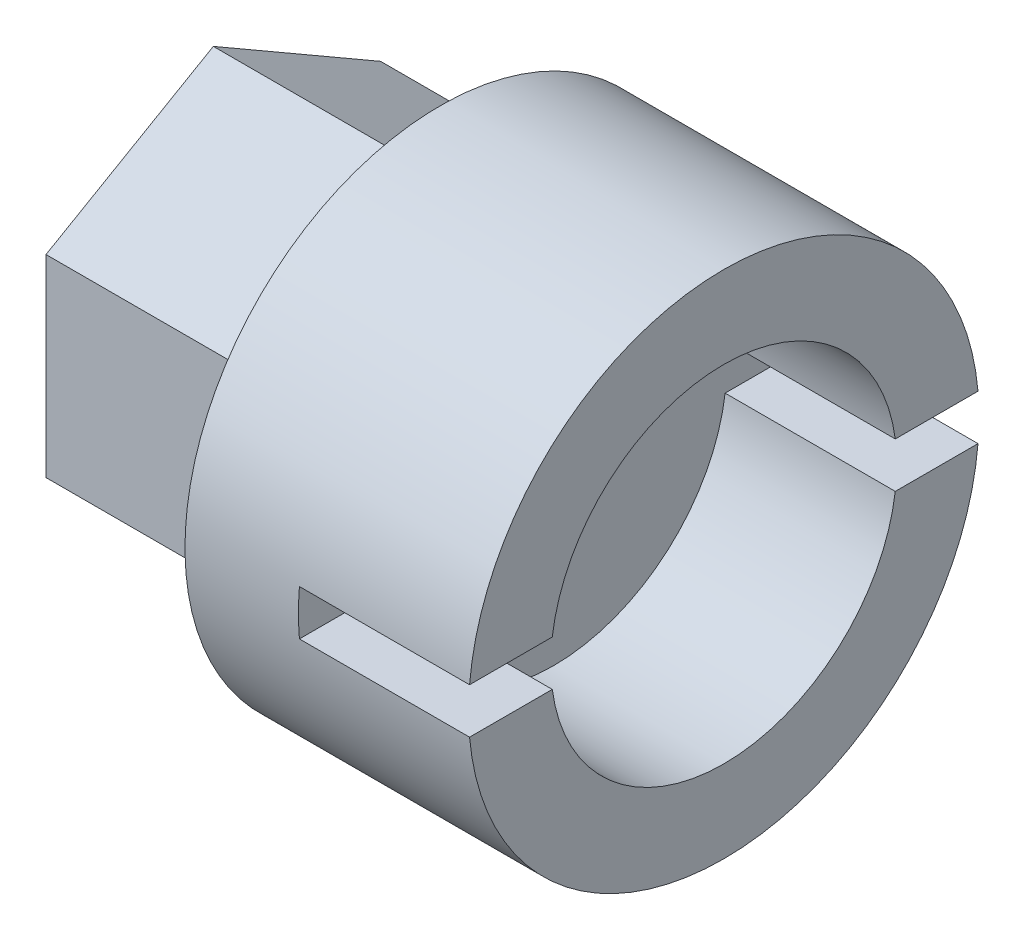
ISO-10303-21;
HEADER;
FILE_DESCRIPTION(('STEP AP214'),'2;1');
FILE_NAME('part.step','',(''),(''),'','','');
FILE_SCHEMA(('AUTOMOTIVE_DESIGN { 1 0 10303 214 1 1 1 1 }'));
ENDSEC;
DATA;
#1=APPLICATION_CONTEXT('core data for automotive mechanical design processes');
#2=APPLICATION_PROTOCOL_DEFINITION('international standard','automotive_design',2000,#1);
#3=PRODUCT_CONTEXT('',#1,'mechanical');
#4=PRODUCT('Part','Part','',(#3));
#5=PRODUCT_RELATED_PRODUCT_CATEGORY('part','',(#4));
#6=PRODUCT_DEFINITION_FORMATION('','',#4);
#7=PRODUCT_DEFINITION_CONTEXT('part definition',#1,'design');
#8=PRODUCT_DEFINITION('design','',#6,#7);
#9=PRODUCT_DEFINITION_SHAPE('','',#8);
#10=(LENGTH_UNIT() NAMED_UNIT(*) SI_UNIT(.MILLI.,.METRE.));
#11=(NAMED_UNIT(*) PLANE_ANGLE_UNIT() SI_UNIT($,.RADIAN.));
#12=(NAMED_UNIT(*) SI_UNIT($,.STERADIAN.) SOLID_ANGLE_UNIT());
#13=UNCERTAINTY_MEASURE_WITH_UNIT(LENGTH_MEASURE(1.E-05),#10,'distance_accuracy_value','');
#14=(GEOMETRIC_REPRESENTATION_CONTEXT(3) GLOBAL_UNCERTAINTY_ASSIGNED_CONTEXT((#13)) GLOBAL_UNIT_ASSIGNED_CONTEXT((#10,
#11,#12)) REPRESENTATION_CONTEXT('',''));
#15=CARTESIAN_POINT('',(0.,0.,0.));
#16=DIRECTION('',(0.,0.,1.));
#17=DIRECTION('',(1.,0.,0.));
#18=AXIS2_PLACEMENT_3D('',#15,#16,#17);
#19=CARTESIAN_POINT('',(9.,0.,0.));
#20=DIRECTION('',(1.,0.,0.));
#21=DIRECTION('',(0.,0.,-1.));
#22=AXIS2_PLACEMENT_3D('',#19,#20,#21);
#23=PLANE('',#22);
#24=CARTESIAN_POINT('',(9.,0.,0.));
#25=DIRECTION('',(1.,0.,0.));
#26=DIRECTION('',(0.,0.,-1.));
#27=AXIS2_PLACEMENT_3D('',#24,#25,#26);
#28=CIRCLE('',#27,4.5);
#29=CARTESIAN_POINT('',(9.,-0.4,4.48218696620299));
#30=VERTEX_POINT('',#29);
#31=CARTESIAN_POINT('',(9.,-0.4,-4.48218696620299));
#32=VERTEX_POINT('',#31);
#33=EDGE_CURVE('E176',#30,#32,#28,.T.);
#34=ORIENTED_EDGE('',*,*,#33,.T.);
#35=DIRECTION('',(0.,0.,1.));
#36=VECTOR('',#35,1.);
#37=CARTESIAN_POINT('',(9.,-0.4,-5.));
#38=LINE('',#37,#36);
#39=CARTESIAN_POINT('',(9.,-0.4,-3.02365672654817));
#40=VERTEX_POINT('',#39);
#41=EDGE_CURVE('E143',#32,#40,#38,.T.);
#42=ORIENTED_EDGE('',*,*,#41,.T.);
#43=CARTESIAN_POINT('',(9.,0.,0.));
#44=DIRECTION('',(1.,0.,0.));
#45=DIRECTION('',(0.,0.,-1.));
#46=AXIS2_PLACEMENT_3D('',#43,#44,#45);
#47=CIRCLE('',#46,3.05);
#48=CARTESIAN_POINT('',(9.,-0.4,3.02365672654817));
#49=VERTEX_POINT('',#48);
#50=EDGE_CURVE('E177',#49,#40,#47,.T.);
#51=ORIENTED_EDGE('',*,*,#50,.F.);
#52=EDGE_CURVE('E53',#49,#30,#38,.T.);
#53=ORIENTED_EDGE('',*,*,#52,.T.);
#54=EDGE_LOOP('',(#34,#42,#51,#53));
#55=FACE_BOUND('',#54,.T.);
#56=ADVANCED_FACE('F39',(#55),#23,.T.);
#57=CARTESIAN_POINT('',(9.,0.,0.));
#58=DIRECTION('',(-1.,0.,0.));
#59=DIRECTION('',(0.,0.,1.));
#60=AXIS2_PLACEMENT_3D('',#57,#58,#59);
#61=CYLINDRICAL_SURFACE('',#60,3.05);
#62=DIRECTION('',(-1.,0.,0.));
#63=VECTOR('',#62,1.);
#64=CARTESIAN_POINT('',(9.,0.4,-3.02365672654817));
#65=LINE('',#64,#63);
#66=CARTESIAN_POINT('',(9.,0.4,-3.02365672654817));
#67=VERTEX_POINT('',#66);
#68=CARTESIAN_POINT('',(6.,0.399999999999999,-3.02365672654817));
#69=VERTEX_POINT('',#68);
#70=EDGE_CURVE('E296',#67,#69,#65,.T.);
#71=ORIENTED_EDGE('',*,*,#70,.F.);
#72=CARTESIAN_POINT('',(9.,0.4,3.02365672654817));
#73=VERTEX_POINT('',#72);
#74=EDGE_CURVE('E173',#67,#73,#47,.T.);
#75=ORIENTED_EDGE('',*,*,#74,.T.);
#76=DIRECTION('',(-1.,0.,0.));
#77=VECTOR('',#76,1.);
#78=CARTESIAN_POINT('',(9.,0.4,3.02365672654817));
#79=LINE('',#78,#77);
#80=CARTESIAN_POINT('',(6.,0.399999999999999,3.02365672654817));
#81=VERTEX_POINT('',#80);
#82=EDGE_CURVE('E300',#81,#73,#79,.F.);
#83=ORIENTED_EDGE('',*,*,#82,.F.);
#84=CARTESIAN_POINT('',(6.,0.,0.));
#85=DIRECTION('',(1.,0.,0.));
#86=DIRECTION('',(0.,0.,-1.));
#87=AXIS2_PLACEMENT_3D('',#84,#85,#86);
#88=CIRCLE('',#87,3.05);
#89=EDGE_CURVE('E169',#69,#81,#88,.T.);
#90=ORIENTED_EDGE('',*,*,#89,.F.);
#91=EDGE_LOOP('',(#71,#75,#83,#90));
#92=FACE_BOUND('',#91,.T.);
#93=ADVANCED_FACE('F262',(#92),#61,.F.);
#94=CARTESIAN_POINT('',(4.,-1.7031832941094,-2.95));
#95=DIRECTION('',(0.,0.,1.));
#96=DIRECTION('',(1.,0.,0.));
#97=AXIS2_PLACEMENT_3D('',#94,#95,#96);
#98=PLANE('',#97);
#99=DIRECTION('',(0.,1.,0.));
#100=VECTOR('',#99,1.);
#101=CARTESIAN_POINT('',(0.,-1.7031832941094,-2.95));
#102=LINE('',#101,#100);
#103=CARTESIAN_POINT('',(0.,-1.7031832941094,-2.95));
#104=VERTEX_POINT('',#103);
#105=CARTESIAN_POINT('',(0.,1.7031832941094,-2.95));
#106=VERTEX_POINT('',#105);
#107=EDGE_CURVE('E183',#104,#106,#102,.T.);
#108=ORIENTED_EDGE('',*,*,#107,.T.);
#109=DIRECTION('',(-1.,0.,0.));
#110=VECTOR('',#109,1.);
#111=CARTESIAN_POINT('',(4.,1.7031832941094,-2.95));
#112=LINE('',#111,#110);
#113=CARTESIAN_POINT('',(4.,1.7031832941094,-2.95));
#114=VERTEX_POINT('',#113);
#115=EDGE_CURVE('E11',#114,#106,#112,.T.);
#116=ORIENTED_EDGE('',*,*,#115,.F.);
#117=DIRECTION('',(0.,1.,0.));
#118=VECTOR('',#117,1.);
#119=CARTESIAN_POINT('',(4.,-1.7031832941094,-2.95));
#120=LINE('',#119,#118);
#121=CARTESIAN_POINT('',(4.,-1.7031832941094,-2.95));
#122=VERTEX_POINT('',#121);
#123=EDGE_CURVE('E189',#122,#114,#120,.T.);
#124=ORIENTED_EDGE('',*,*,#123,.F.);
#125=DIRECTION('',(-1.,0.,0.));
#126=VECTOR('',#125,1.);
#127=CARTESIAN_POINT('',(4.,-1.7031832941094,-2.95));
#128=LINE('',#127,#126);
#129=EDGE_CURVE('E202',#122,#104,#128,.T.);
#130=ORIENTED_EDGE('',*,*,#129,.T.);
#131=EDGE_LOOP('',(#108,#116,#124,#130));
#132=FACE_BOUND('',#131,.T.);
#133=ADVANCED_FACE('F41',(#132),#98,.F.);
#134=CARTESIAN_POINT('',(4.,1.7031832941094,-2.95));
#135=DIRECTION('',(0.,-0.866025403784439,0.5));
#136=DIRECTION('',(0.,-0.5,-0.866025403784439));
#137=AXIS2_PLACEMENT_3D('',#134,#135,#136);
#138=PLANE('',#137);
#139=DIRECTION('',(0.,0.5,0.866025403784439));
#140=VECTOR('',#139,1.);
#141=CARTESIAN_POINT('',(0.,1.7031832941094,-2.95));
#142=LINE('',#141,#140);
#143=CARTESIAN_POINT('',(0.,3.40636658821879,0.));
#144=VERTEX_POINT('',#143);
#145=EDGE_CURVE('E208',#106,#144,#142,.T.);
#146=ORIENTED_EDGE('',*,*,#145,.T.);
#147=DIRECTION('',(-1.,0.,0.));
#148=VECTOR('',#147,1.);
#149=CARTESIAN_POINT('',(4.,3.40636658821879,0.));
#150=LINE('',#149,#148);
#151=CARTESIAN_POINT('',(4.,3.40636658821879,0.));
#152=VERTEX_POINT('',#151);
#153=EDGE_CURVE('E50',#152,#144,#150,.T.);
#154=ORIENTED_EDGE('',*,*,#153,.F.);
#155=DIRECTION('',(0.,0.5,0.866025403784439));
#156=VECTOR('',#155,1.);
#157=CARTESIAN_POINT('',(4.,1.7031832941094,-2.95));
#158=LINE('',#157,#156);
#159=EDGE_CURVE('E188',#114,#152,#158,.T.);
#160=ORIENTED_EDGE('',*,*,#159,.F.);
#161=ORIENTED_EDGE('',*,*,#115,.T.);
#162=EDGE_LOOP('',(#146,#154,#160,#161));
#163=FACE_BOUND('',#162,.T.);
#164=ADVANCED_FACE('F248',(#163),#138,.F.);
#165=CARTESIAN_POINT('',(4.,3.40636658821879,0.));
#166=DIRECTION('',(0.,-0.866025403784439,-0.5));
#167=DIRECTION('',(0.,0.5,-0.866025403784438));
#168=AXIS2_PLACEMENT_3D('',#165,#166,#167);
#169=PLANE('',#168);
#170=DIRECTION('',(0.,-0.5,0.866025403784438));
#171=VECTOR('',#170,1.);
#172=CARTESIAN_POINT('',(0.,3.40636658821879,0.));
#173=LINE('',#172,#171);
#174=CARTESIAN_POINT('',(0.,1.70318329410939,2.95));
#175=VERTEX_POINT('',#174);
#176=EDGE_CURVE('E209',#144,#175,#173,.T.);
#177=ORIENTED_EDGE('',*,*,#176,.T.);
#178=DIRECTION('',(-1.,0.,0.));
#179=VECTOR('',#178,1.);
#180=CARTESIAN_POINT('',(4.,1.70318329410939,2.95));
#181=LINE('',#180,#179);
#182=CARTESIAN_POINT('',(4.,1.70318329410939,2.95));
#183=VERTEX_POINT('',#182);
#184=EDGE_CURVE('E223',#183,#175,#181,.T.);
#185=ORIENTED_EDGE('',*,*,#184,.F.);
#186=DIRECTION('',(0.,-0.5,0.866025403784438));
#187=VECTOR('',#186,1.);
#188=CARTESIAN_POINT('',(4.,3.40636658821879,0.));
#189=LINE('',#188,#187);
#190=EDGE_CURVE('E194',#152,#183,#189,.T.);
#191=ORIENTED_EDGE('',*,*,#190,.F.);
#192=ORIENTED_EDGE('',*,*,#153,.T.);
#193=EDGE_LOOP('',(#177,#185,#191,#192));
#194=FACE_BOUND('',#193,.T.);
#195=ADVANCED_FACE('F231',(#194),#169,.F.);
#196=CARTESIAN_POINT('',(4.,1.70318329410939,2.95));
#197=DIRECTION('',(0.,0.,-1.));
#198=DIRECTION('',(-1.,0.,0.));
#199=AXIS2_PLACEMENT_3D('',#196,#197,#198);
#200=PLANE('',#199);
#201=DIRECTION('',(0.,-1.,0.));
#202=VECTOR('',#201,1.);
#203=CARTESIAN_POINT('',(0.,1.70318329410939,2.95));
#204=LINE('',#203,#202);
#205=CARTESIAN_POINT('',(0.,-1.7031832941094,2.95));
#206=VERTEX_POINT('',#205);
#207=EDGE_CURVE('E215',#175,#206,#204,.T.);
#208=ORIENTED_EDGE('',*,*,#207,.T.);
#209=DIRECTION('',(-1.,0.,0.));
#210=VECTOR('',#209,1.);
#211=CARTESIAN_POINT('',(4.,-1.7031832941094,2.95));
#212=LINE('',#211,#210);
#213=CARTESIAN_POINT('',(4.,-1.7031832941094,2.95));
#214=VERTEX_POINT('',#213);
#215=EDGE_CURVE('E225',#214,#206,#212,.T.);
#216=ORIENTED_EDGE('',*,*,#215,.F.);
#217=DIRECTION('',(0.,-1.,0.));
#218=VECTOR('',#217,1.);
#219=CARTESIAN_POINT('',(4.,1.70318329410939,2.95));
#220=LINE('',#219,#218);
#221=EDGE_CURVE('E198',#183,#214,#220,.T.);
#222=ORIENTED_EDGE('',*,*,#221,.F.);
#223=ORIENTED_EDGE('',*,*,#184,.T.);
#224=EDGE_LOOP('',(#208,#216,#222,#223));
#225=FACE_BOUND('',#224,.T.);
#226=ADVANCED_FACE('F238',(#225),#200,.F.);
#227=CARTESIAN_POINT('',(4.,-1.7031832941094,2.95));
#228=DIRECTION('',(0.,0.866025403784439,-0.5));
#229=DIRECTION('',(0.,0.5,0.866025403784438));
#230=AXIS2_PLACEMENT_3D('',#227,#228,#229);
#231=PLANE('',#230);
#232=DIRECTION('',(0.,-0.5,-0.866025403784438));
#233=VECTOR('',#232,1.);
#234=CARTESIAN_POINT('',(0.,-1.7031832941094,2.95));
#235=LINE('',#234,#233);
#236=CARTESIAN_POINT('',(0.,-3.40636658821879,0.));
#237=VERTEX_POINT('',#236);
#238=EDGE_CURVE('E212',#206,#237,#235,.T.);
#239=ORIENTED_EDGE('',*,*,#238,.T.);
#240=DIRECTION('',(-1.,0.,0.));
#241=VECTOR('',#240,1.);
#242=CARTESIAN_POINT('',(4.,-3.40636658821879,0.));
#243=LINE('',#242,#241);
#244=CARTESIAN_POINT('',(4.,-3.40636658821879,0.));
#245=VERTEX_POINT('',#244);
#246=EDGE_CURVE('E218',#245,#237,#243,.T.);
#247=ORIENTED_EDGE('',*,*,#246,.F.);
#248=DIRECTION('',(0.,-0.5,-0.866025403784438));
#249=VECTOR('',#248,1.);
#250=CARTESIAN_POINT('',(4.,-1.7031832941094,2.95));
#251=LINE('',#250,#249);
#252=EDGE_CURVE('E200',#214,#245,#251,.T.);
#253=ORIENTED_EDGE('',*,*,#252,.F.);
#254=ORIENTED_EDGE('',*,*,#215,.T.);
#255=EDGE_LOOP('',(#239,#247,#253,#254));
#256=FACE_BOUND('',#255,.T.);
#257=ADVANCED_FACE('F243',(#256),#231,.F.);
#258=CARTESIAN_POINT('',(4.,-3.40636658821879,0.));
#259=DIRECTION('',(0.,0.866025403784439,0.5));
#260=DIRECTION('',(0.,-0.5,0.866025403784439));
#261=AXIS2_PLACEMENT_3D('',#258,#259,#260);
#262=PLANE('',#261);
#263=DIRECTION('',(0.,0.5,-0.866025403784438));
#264=VECTOR('',#263,1.);
#265=CARTESIAN_POINT('',(0.,-3.40636658821879,0.));
#266=LINE('',#265,#264);
#267=EDGE_CURVE('E187',#237,#104,#266,.T.);
#268=ORIENTED_EDGE('',*,*,#267,.T.);
#269=ORIENTED_EDGE('',*,*,#129,.F.);
#270=DIRECTION('',(0.,0.5,-0.866025403784438));
#271=VECTOR('',#270,1.);
#272=CARTESIAN_POINT('',(4.,-3.40636658821879,0.));
#273=LINE('',#272,#271);
#274=EDGE_CURVE('E205',#245,#122,#273,.T.);
#275=ORIENTED_EDGE('',*,*,#274,.F.);
#276=ORIENTED_EDGE('',*,*,#246,.T.);
#277=EDGE_LOOP('',(#268,#269,#275,#276));
#278=FACE_BOUND('',#277,.T.);
#279=ADVANCED_FACE('F251',(#278),#262,.F.);
#280=CARTESIAN_POINT('',(0.,0.,0.));
#281=DIRECTION('',(1.,0.,0.));
#282=DIRECTION('',(0.,0.,-1.));
#283=AXIS2_PLACEMENT_3D('',#280,#281,#282);
#284=PLANE('',#283);
#285=ORIENTED_EDGE('',*,*,#107,.F.);
#286=ORIENTED_EDGE('',*,*,#267,.F.);
#287=ORIENTED_EDGE('',*,*,#238,.F.);
#288=ORIENTED_EDGE('',*,*,#207,.F.);
#289=ORIENTED_EDGE('',*,*,#176,.F.);
#290=ORIENTED_EDGE('',*,*,#145,.F.);
#291=EDGE_LOOP('',(#285,#286,#287,#288,#289,#290));
#292=FACE_BOUND('',#291,.T.);
#293=ADVANCED_FACE('F237',(#292),#284,.F.);
#294=CARTESIAN_POINT('',(4.,0.,0.));
#295=DIRECTION('',(1.,0.,0.));
#296=DIRECTION('',(0.,0.,-1.));
#297=AXIS2_PLACEMENT_3D('',#294,#295,#296);
#298=PLANE('',#297);
#299=CARTESIAN_POINT('',(4.,0.,0.));
#300=DIRECTION('',(1.,0.,0.));
#301=DIRECTION('',(0.,0.,-1.));
#302=AXIS2_PLACEMENT_3D('',#299,#300,#301);
#303=CIRCLE('',#302,4.5);
#304=CARTESIAN_POINT('',(4.,0.,-4.5));
#305=VERTEX_POINT('',#304);
#306=EDGE_CURVE('E185',#305,#305,#303,.T.);
#307=ORIENTED_EDGE('',*,*,#306,.F.);
#308=EDGE_LOOP('',(#307));
#309=FACE_BOUND('',#308,.T.);
#310=ORIENTED_EDGE('',*,*,#274,.T.);
#311=ORIENTED_EDGE('',*,*,#123,.T.);
#312=ORIENTED_EDGE('',*,*,#159,.T.);
#313=ORIENTED_EDGE('',*,*,#190,.T.);
#314=ORIENTED_EDGE('',*,*,#221,.T.);
#315=ORIENTED_EDGE('',*,*,#252,.T.);
#316=EDGE_LOOP('',(#310,#311,#312,#313,#314,#315));
#317=FACE_BOUND('',#316,.T.);
#318=ADVANCED_FACE('F247',(#309,#317),#298,.F.);
#319=CARTESIAN_POINT('',(6.,0.,0.));
#320=DIRECTION('',(-1.,0.,0.));
#321=DIRECTION('',(0.,0.,1.));
#322=AXIS2_PLACEMENT_3D('',#319,#320,#321);
#323=CYLINDRICAL_SURFACE('',#322,4.5);
#324=CARTESIAN_POINT('',(9.,0.4,-4.48218696620299));
#325=VERTEX_POINT('',#324);
#326=CARTESIAN_POINT('',(9.,0.4,4.48218696620299));
#327=VERTEX_POINT('',#326);
#328=EDGE_CURVE('E178',#325,#327,#28,.T.);
#329=ORIENTED_EDGE('',*,*,#328,.F.);
#330=DIRECTION('',(-1.,0.,0.));
#331=VECTOR('',#330,1.);
#332=CARTESIAN_POINT('',(6.,0.399999999999999,-4.48218696620299));
#333=LINE('',#332,#331);
#334=CARTESIAN_POINT('',(6.,0.399999999999999,-4.48218696620299));
#335=VERTEX_POINT('',#334);
#336=EDGE_CURVE('E164',#325,#335,#333,.T.);
#337=ORIENTED_EDGE('',*,*,#336,.T.);
#338=CARTESIAN_POINT('',(6.,0.,0.));
#339=DIRECTION('',(-1.,0.,0.));
#340=DIRECTION('',(0.,0.,1.));
#341=AXIS2_PLACEMENT_3D('',#338,#339,#340);
#342=CIRCLE('',#341,4.5);
#343=CARTESIAN_POINT('',(6.,-0.400000000000001,-4.48218696620299));
#344=VERTEX_POINT('',#343);
#345=EDGE_CURVE('E152',#335,#344,#342,.T.);
#346=ORIENTED_EDGE('',*,*,#345,.T.);
#347=DIRECTION('',(-1.,0.,0.));
#348=VECTOR('',#347,1.);
#349=CARTESIAN_POINT('',(6.,-0.400000000000001,-4.48218696620299));
#350=LINE('',#349,#348);
#351=EDGE_CURVE('E139',#344,#32,#350,.F.);
#352=ORIENTED_EDGE('',*,*,#351,.T.);
#353=ORIENTED_EDGE('',*,*,#33,.F.);
#354=DIRECTION('',(-1.,0.,0.));
#355=VECTOR('',#354,1.);
#356=CARTESIAN_POINT('',(6.,-0.400000000000001,4.48218696620299));
#357=LINE('',#356,#355);
#358=CARTESIAN_POINT('',(6.,-0.400000000000001,4.48218696620299));
#359=VERTEX_POINT('',#358);
#360=EDGE_CURVE('E148',#30,#359,#357,.T.);
#361=ORIENTED_EDGE('',*,*,#360,.T.);
#362=CARTESIAN_POINT('',(6.,0.399999999999999,4.48218696620299));
#363=VERTEX_POINT('',#362);
#364=EDGE_CURVE('E167',#359,#363,#342,.T.);
#365=ORIENTED_EDGE('',*,*,#364,.T.);
#366=DIRECTION('',(-1.,0.,0.));
#367=VECTOR('',#366,1.);
#368=CARTESIAN_POINT('',(6.,0.399999999999999,4.48218696620299));
#369=LINE('',#368,#367);
#370=EDGE_CURVE('E291',#363,#327,#369,.F.);
#371=ORIENTED_EDGE('',*,*,#370,.T.);
#372=EDGE_LOOP('',(#329,#337,#346,#352,#353,#361,#365,#371));
#373=FACE_BOUND('',#372,.T.);
#374=ORIENTED_EDGE('',*,*,#306,.T.);
#375=EDGE_LOOP('',(#374));
#376=FACE_BOUND('',#375,.T.);
#377=ADVANCED_FACE('F162',(#373,#376),#323,.T.);
#378=DIRECTION('',(0.,0.,1.));
#379=VECTOR('',#378,1.);
#380=CARTESIAN_POINT('',(9.,0.4,-5.));
#381=LINE('',#380,#379);
#382=EDGE_CURVE('E282',#325,#67,#381,.T.);
#383=ORIENTED_EDGE('',*,*,#382,.F.);
#384=ORIENTED_EDGE('',*,*,#328,.T.);
#385=EDGE_CURVE('E290',#73,#327,#381,.T.);
#386=ORIENTED_EDGE('',*,*,#385,.F.);
#387=ORIENTED_EDGE('',*,*,#74,.F.);
#388=EDGE_LOOP('',(#383,#384,#386,#387));
#389=FACE_BOUND('',#388,.T.);
#390=ADVANCED_FACE('F270',(#389),#23,.T.);
#391=DIRECTION('',(-1.,0.,0.));
#392=VECTOR('',#391,1.);
#393=CARTESIAN_POINT('',(9.,-0.4,3.02365672654817));
#394=LINE('',#393,#392);
#395=CARTESIAN_POINT('',(6.,-0.400000000000001,3.02365672654817));
#396=VERTEX_POINT('',#395);
#397=EDGE_CURVE('E150',#49,#396,#394,.T.);
#398=ORIENTED_EDGE('',*,*,#397,.F.);
#399=ORIENTED_EDGE('',*,*,#50,.T.);
#400=DIRECTION('',(-1.,0.,0.));
#401=VECTOR('',#400,1.);
#402=CARTESIAN_POINT('',(9.,-0.4,-3.02365672654817));
#403=LINE('',#402,#401);
#404=CARTESIAN_POINT('',(6.,-0.400000000000001,-3.02365672654817));
#405=VERTEX_POINT('',#404);
#406=EDGE_CURVE('E288',#405,#40,#403,.F.);
#407=ORIENTED_EDGE('',*,*,#406,.F.);
#408=EDGE_CURVE('E158',#396,#405,#88,.T.);
#409=ORIENTED_EDGE('',*,*,#408,.F.);
#410=EDGE_LOOP('',(#398,#399,#407,#409));
#411=FACE_BOUND('',#410,.T.);
#412=ADVANCED_FACE('F272',(#411),#61,.F.);
#413=CARTESIAN_POINT('',(6.,0.,0.));
#414=DIRECTION('',(1.,0.,0.));
#415=DIRECTION('',(0.,0.,-1.));
#416=AXIS2_PLACEMENT_3D('',#413,#414,#415);
#417=PLANE('',#416);
#418=ORIENTED_EDGE('',*,*,#89,.T.);
#419=DIRECTION('',(0.,0.,1.));
#420=VECTOR('',#419,1.);
#421=CARTESIAN_POINT('',(6.,0.399999999999999,-5.));
#422=LINE('',#421,#420);
#423=EDGE_CURVE('E305',#81,#363,#422,.T.);
#424=ORIENTED_EDGE('',*,*,#423,.T.);
#425=ORIENTED_EDGE('',*,*,#364,.F.);
#426=DIRECTION('',(0.,0.,1.));
#427=VECTOR('',#426,1.);
#428=CARTESIAN_POINT('',(6.,-0.400000000000001,-5.));
#429=LINE('',#428,#427);
#430=EDGE_CURVE('E157',#396,#359,#429,.T.);
#431=ORIENTED_EDGE('',*,*,#430,.F.);
#432=ORIENTED_EDGE('',*,*,#408,.T.);
#433=EDGE_CURVE('E61',#344,#405,#429,.T.);
#434=ORIENTED_EDGE('',*,*,#433,.F.);
#435=ORIENTED_EDGE('',*,*,#345,.F.);
#436=EDGE_CURVE('E308',#335,#69,#422,.T.);
#437=ORIENTED_EDGE('',*,*,#436,.T.);
#438=EDGE_LOOP('',(#418,#424,#425,#431,#432,#434,#435,#437));
#439=FACE_BOUND('',#438,.T.);
#440=ADVANCED_FACE('F155',(#439),#417,.T.);
#441=CARTESIAN_POINT('',(6.,0.399999999999999,-5.));
#442=DIRECTION('',(0.,1.,0.));
#443=DIRECTION('',(-1.,0.,0.));
#444=AXIS2_PLACEMENT_3D('',#441,#442,#443);
#445=PLANE('',#444);
#446=ORIENTED_EDGE('',*,*,#382,.T.);
#447=ORIENTED_EDGE('',*,*,#70,.T.);
#448=ORIENTED_EDGE('',*,*,#436,.F.);
#449=ORIENTED_EDGE('',*,*,#336,.F.);
#450=EDGE_LOOP('',(#446,#447,#448,#449));
#451=FACE_BOUND('',#450,.T.);
#452=ADVANCED_FACE('F312',(#451),#445,.F.);
#453=CARTESIAN_POINT('',(6.,-0.400000000000001,-5.));
#454=DIRECTION('',(0.,-1.,0.));
#455=DIRECTION('',(1.,0.,0.));
#456=AXIS2_PLACEMENT_3D('',#453,#454,#455);
#457=PLANE('',#456);
#458=ORIENTED_EDGE('',*,*,#433,.T.);
#459=ORIENTED_EDGE('',*,*,#406,.T.);
#460=ORIENTED_EDGE('',*,*,#41,.F.);
#461=ORIENTED_EDGE('',*,*,#351,.F.);
#462=EDGE_LOOP('',(#458,#459,#460,#461));
#463=FACE_BOUND('',#462,.T.);
#464=ADVANCED_FACE('F138',(#463),#457,.F.);
#465=ORIENTED_EDGE('',*,*,#423,.F.);
#466=ORIENTED_EDGE('',*,*,#82,.T.);
#467=ORIENTED_EDGE('',*,*,#385,.T.);
#468=ORIENTED_EDGE('',*,*,#370,.F.);
#469=EDGE_LOOP('',(#465,#466,#467,#468));
#470=FACE_BOUND('',#469,.T.);
#471=ADVANCED_FACE('F314',(#470),#445,.F.);
#472=ORIENTED_EDGE('',*,*,#52,.F.);
#473=ORIENTED_EDGE('',*,*,#397,.T.);
#474=ORIENTED_EDGE('',*,*,#430,.T.);
#475=ORIENTED_EDGE('',*,*,#360,.F.);
#476=EDGE_LOOP('',(#472,#473,#474,#475));
#477=FACE_BOUND('',#476,.T.);
#478=ADVANCED_FACE('F313',(#477),#457,.F.);
#479=CLOSED_SHELL('',(#56,#93,#133,#164,#195,#226,#257,#279,#293,#318,#377,#390,#412,#440,#452,
#464,#471,#478));
#480=MANIFOLD_SOLID_BREP('B2',#479);
#481=ADVANCED_BREP_SHAPE_REPRESENTATION('',(#18,#480),#14);
#482=SHAPE_DEFINITION_REPRESENTATION(#9,#481);
ENDSEC;
END-ISO-10303-21;
